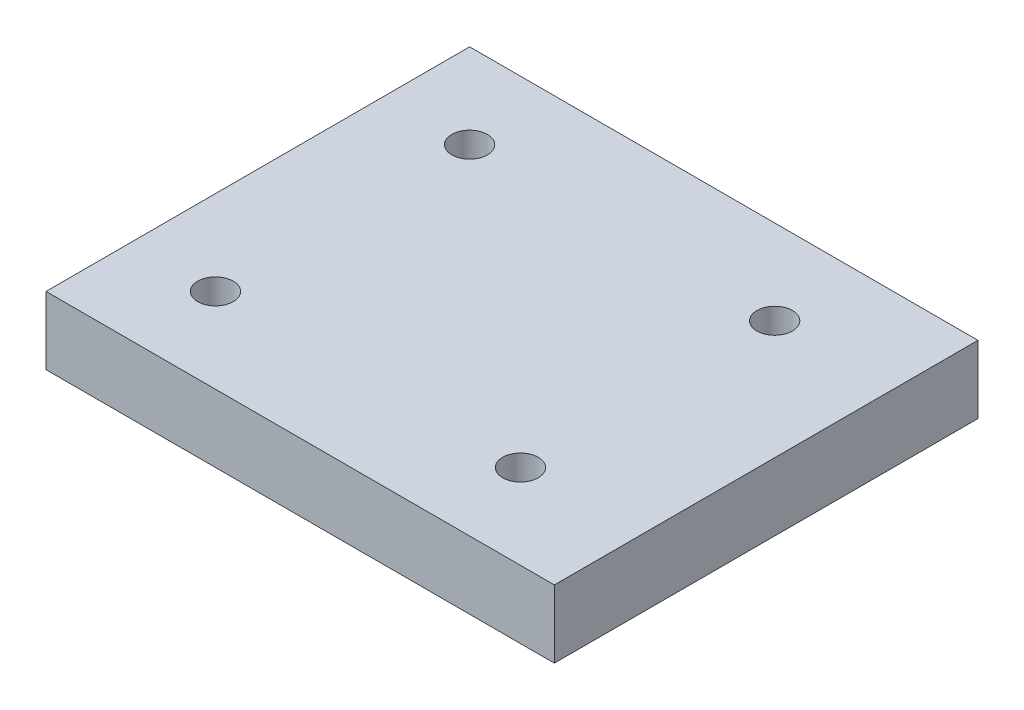
ISO-10303-21;
HEADER;
FILE_DESCRIPTION(('STEP AP214'),'2;1');
FILE_NAME('part.step','',(''),(''),'','','');
FILE_SCHEMA(('AUTOMOTIVE_DESIGN { 1 0 10303 214 1 1 1 1 }'));
ENDSEC;
DATA;
#1=APPLICATION_CONTEXT('core data for automotive mechanical design processes');
#2=APPLICATION_PROTOCOL_DEFINITION('international standard','automotive_design',2000,#1);
#3=PRODUCT_CONTEXT('',#1,'mechanical');
#4=PRODUCT('Part','Part','',(#3));
#5=PRODUCT_RELATED_PRODUCT_CATEGORY('part','',(#4));
#6=PRODUCT_DEFINITION_FORMATION('','',#4);
#7=PRODUCT_DEFINITION_CONTEXT('part definition',#1,'design');
#8=PRODUCT_DEFINITION('design','',#6,#7);
#9=PRODUCT_DEFINITION_SHAPE('','',#8);
#10=(LENGTH_UNIT() NAMED_UNIT(*) SI_UNIT(.MILLI.,.METRE.));
#11=(NAMED_UNIT(*) PLANE_ANGLE_UNIT() SI_UNIT($,.RADIAN.));
#12=(NAMED_UNIT(*) SI_UNIT($,.STERADIAN.) SOLID_ANGLE_UNIT());
#13=UNCERTAINTY_MEASURE_WITH_UNIT(LENGTH_MEASURE(1.E-05),#10,'distance_accuracy_value','');
#14=(GEOMETRIC_REPRESENTATION_CONTEXT(3) GLOBAL_UNCERTAINTY_ASSIGNED_CONTEXT((#13)) GLOBAL_UNIT_ASSIGNED_CONTEXT((#10,
#11,#12)) REPRESENTATION_CONTEXT('',''));
#15=CARTESIAN_POINT('',(0.,0.,0.));
#16=DIRECTION('',(0.,0.,1.));
#17=DIRECTION('',(1.,0.,0.));
#18=AXIS2_PLACEMENT_3D('',#15,#16,#17);
#19=CARTESIAN_POINT('',(30.,8.,-25.));
#20=DIRECTION('',(-1.,0.,0.));
#21=DIRECTION('',(0.,0.,1.));
#22=AXIS2_PLACEMENT_3D('',#19,#20,#21);
#23=PLANE('',#22);
#24=DIRECTION('',(0.,0.,-1.));
#25=VECTOR('',#24,1.);
#26=CARTESIAN_POINT('',(30.,0.,-25.));
#27=LINE('',#26,#25);
#28=CARTESIAN_POINT('',(30.,0.,25.));
#29=VERTEX_POINT('',#28);
#30=CARTESIAN_POINT('',(30.,0.,-25.));
#31=VERTEX_POINT('',#30);
#32=EDGE_CURVE('E104',#29,#31,#27,.T.);
#33=ORIENTED_EDGE('',*,*,#32,.T.);
#34=DIRECTION('',(0.,-1.,0.));
#35=VECTOR('',#34,1.);
#36=CARTESIAN_POINT('',(30.,8.,-25.));
#37=LINE('',#36,#35);
#38=CARTESIAN_POINT('',(30.,8.,-25.));
#39=VERTEX_POINT('',#38);
#40=EDGE_CURVE('E11',#39,#31,#37,.T.);
#41=ORIENTED_EDGE('',*,*,#40,.F.);
#42=DIRECTION('',(0.,0.,-1.));
#43=VECTOR('',#42,1.);
#44=CARTESIAN_POINT('',(30.,8.,-25.));
#45=LINE('',#44,#43);
#46=CARTESIAN_POINT('',(30.,8.,25.));
#47=VERTEX_POINT('',#46);
#48=EDGE_CURVE('E92',#47,#39,#45,.T.);
#49=ORIENTED_EDGE('',*,*,#48,.F.);
#50=DIRECTION('',(0.,-1.,0.));
#51=VECTOR('',#50,1.);
#52=CARTESIAN_POINT('',(30.,8.,25.));
#53=LINE('',#52,#51);
#54=EDGE_CURVE('E100',#47,#29,#53,.T.);
#55=ORIENTED_EDGE('',*,*,#54,.T.);
#56=EDGE_LOOP('',(#33,#41,#49,#55));
#57=FACE_BOUND('',#56,.T.);
#58=ADVANCED_FACE('F41',(#57),#23,.F.);
#59=CARTESIAN_POINT('',(-30.,8.,-25.));
#60=DIRECTION('',(0.,0.,1.));
#61=DIRECTION('',(1.,0.,0.));
#62=AXIS2_PLACEMENT_3D('',#59,#60,#61);
#63=PLANE('',#62);
#64=DIRECTION('',(-1.,0.,0.));
#65=VECTOR('',#64,1.);
#66=CARTESIAN_POINT('',(-30.,0.,-25.));
#67=LINE('',#66,#65);
#68=CARTESIAN_POINT('',(-30.,0.,-25.));
#69=VERTEX_POINT('',#68);
#70=EDGE_CURVE('E96',#31,#69,#67,.T.);
#71=ORIENTED_EDGE('',*,*,#70,.T.);
#72=DIRECTION('',(0.,-1.,0.));
#73=VECTOR('',#72,1.);
#74=CARTESIAN_POINT('',(-30.,8.,-25.));
#75=LINE('',#74,#73);
#76=CARTESIAN_POINT('',(-30.,8.,-25.));
#77=VERTEX_POINT('',#76);
#78=EDGE_CURVE('E49',#77,#69,#75,.T.);
#79=ORIENTED_EDGE('',*,*,#78,.F.);
#80=DIRECTION('',(-1.,0.,0.));
#81=VECTOR('',#80,1.);
#82=CARTESIAN_POINT('',(-30.,8.,-25.));
#83=LINE('',#82,#81);
#84=EDGE_CURVE('E87',#39,#77,#83,.T.);
#85=ORIENTED_EDGE('',*,*,#84,.F.);
#86=ORIENTED_EDGE('',*,*,#40,.T.);
#87=EDGE_LOOP('',(#71,#79,#85,#86));
#88=FACE_BOUND('',#87,.T.);
#89=ADVANCED_FACE('F95',(#88),#63,.F.);
#90=CARTESIAN_POINT('',(-30.,8.,-25.));
#91=DIRECTION('',(1.,0.,0.));
#92=DIRECTION('',(0.,0.,-1.));
#93=AXIS2_PLACEMENT_3D('',#90,#91,#92);
#94=PLANE('',#93);
#95=DIRECTION('',(0.,0.,1.));
#96=VECTOR('',#95,1.);
#97=CARTESIAN_POINT('',(-30.,0.,-25.));
#98=LINE('',#97,#96);
#99=CARTESIAN_POINT('',(-30.,0.,25.));
#100=VERTEX_POINT('',#99);
#101=EDGE_CURVE('E74',#69,#100,#98,.T.);
#102=ORIENTED_EDGE('',*,*,#101,.T.);
#103=DIRECTION('',(0.,-1.,0.));
#104=VECTOR('',#103,1.);
#105=CARTESIAN_POINT('',(-30.,8.,25.));
#106=LINE('',#105,#104);
#107=CARTESIAN_POINT('',(-30.,8.,25.));
#108=VERTEX_POINT('',#107);
#109=EDGE_CURVE('E97',#108,#100,#106,.T.);
#110=ORIENTED_EDGE('',*,*,#109,.F.);
#111=DIRECTION('',(0.,0.,1.));
#112=VECTOR('',#111,1.);
#113=CARTESIAN_POINT('',(-30.,8.,-25.));
#114=LINE('',#113,#112);
#115=EDGE_CURVE('E90',#77,#108,#114,.T.);
#116=ORIENTED_EDGE('',*,*,#115,.F.);
#117=ORIENTED_EDGE('',*,*,#78,.T.);
#118=EDGE_LOOP('',(#102,#110,#116,#117));
#119=FACE_BOUND('',#118,.T.);
#120=ADVANCED_FACE('F98',(#119),#94,.F.);
#121=CARTESIAN_POINT('',(-30.,8.,25.));
#122=DIRECTION('',(0.,0.,-1.));
#123=DIRECTION('',(-1.,0.,0.));
#124=AXIS2_PLACEMENT_3D('',#121,#122,#123);
#125=PLANE('',#124);
#126=DIRECTION('',(1.,0.,0.));
#127=VECTOR('',#126,1.);
#128=CARTESIAN_POINT('',(-30.,0.,25.));
#129=LINE('',#128,#127);
#130=EDGE_CURVE('E80',#100,#29,#129,.T.);
#131=ORIENTED_EDGE('',*,*,#130,.T.);
#132=ORIENTED_EDGE('',*,*,#54,.F.);
#133=DIRECTION('',(1.,0.,0.));
#134=VECTOR('',#133,1.);
#135=CARTESIAN_POINT('',(-30.,8.,25.));
#136=LINE('',#135,#134);
#137=EDGE_CURVE('E57',#108,#47,#136,.T.);
#138=ORIENTED_EDGE('',*,*,#137,.F.);
#139=ORIENTED_EDGE('',*,*,#109,.T.);
#140=EDGE_LOOP('',(#131,#132,#138,#139));
#141=FACE_BOUND('',#140,.T.);
#142=ADVANCED_FACE('F112',(#141),#125,.F.);
#143=CARTESIAN_POINT('',(0.,8.,0.));
#144=DIRECTION('',(0.,1.,0.));
#145=DIRECTION('',(0.,0.,1.));
#146=AXIS2_PLACEMENT_3D('',#143,#144,#145);
#147=PLANE('',#146);
#148=CARTESIAN_POINT('',(-20.,8.,15.));
#149=DIRECTION('',(0.,1.,0.));
#150=DIRECTION('',(0.,0.,1.));
#151=AXIS2_PLACEMENT_3D('',#148,#149,#150);
#152=CIRCLE('',#151,2.1);
#153=CARTESIAN_POINT('',(-20.,8.,17.1));
#154=VERTEX_POINT('',#153);
#155=EDGE_CURVE('E138',#154,#154,#152,.T.);
#156=ORIENTED_EDGE('',*,*,#155,.F.);
#157=EDGE_LOOP('',(#156));
#158=FACE_BOUND('',#157,.T.);
#159=CARTESIAN_POINT('',(16.,8.,15.));
#160=DIRECTION('',(0.,1.,0.));
#161=DIRECTION('',(0.,0.,1.));
#162=AXIS2_PLACEMENT_3D('',#159,#160,#161);
#163=CIRCLE('',#162,2.1);
#164=CARTESIAN_POINT('',(16.,8.,17.1));
#165=VERTEX_POINT('',#164);
#166=EDGE_CURVE('E132',#165,#165,#163,.T.);
#167=ORIENTED_EDGE('',*,*,#166,.F.);
#168=EDGE_LOOP('',(#167));
#169=FACE_BOUND('',#168,.T.);
#170=CARTESIAN_POINT('',(16.,8.,-15.));
#171=DIRECTION('',(0.,1.,0.));
#172=DIRECTION('',(0.,0.,1.));
#173=AXIS2_PLACEMENT_3D('',#170,#171,#172);
#174=CIRCLE('',#173,2.1);
#175=CARTESIAN_POINT('',(16.,8.,-12.9));
#176=VERTEX_POINT('',#175);
#177=EDGE_CURVE('E126',#176,#176,#174,.T.);
#178=ORIENTED_EDGE('',*,*,#177,.F.);
#179=EDGE_LOOP('',(#178));
#180=FACE_BOUND('',#179,.T.);
#181=CARTESIAN_POINT('',(-20.,8.,-15.));
#182=DIRECTION('',(0.,1.,0.));
#183=DIRECTION('',(0.,0.,1.));
#184=AXIS2_PLACEMENT_3D('',#181,#182,#183);
#185=CIRCLE('',#184,2.1);
#186=CARTESIAN_POINT('',(-20.,8.,-12.9));
#187=VERTEX_POINT('',#186);
#188=EDGE_CURVE('E120',#187,#187,#185,.T.);
#189=ORIENTED_EDGE('',*,*,#188,.F.);
#190=EDGE_LOOP('',(#189));
#191=FACE_BOUND('',#190,.T.);
#192=ORIENTED_EDGE('',*,*,#48,.T.);
#193=ORIENTED_EDGE('',*,*,#84,.T.);
#194=ORIENTED_EDGE('',*,*,#115,.T.);
#195=ORIENTED_EDGE('',*,*,#137,.T.);
#196=EDGE_LOOP('',(#192,#193,#194,#195));
#197=FACE_BOUND('',#196,.T.);
#198=ADVANCED_FACE('F88',(#158,#169,#180,#191,#197),#147,.T.);
#199=CARTESIAN_POINT('',(0.,0.,0.));
#200=DIRECTION('',(0.,1.,0.));
#201=DIRECTION('',(0.,0.,1.));
#202=AXIS2_PLACEMENT_3D('',#199,#200,#201);
#203=PLANE('',#202);
#204=CARTESIAN_POINT('',(-20.,0.,15.));
#205=DIRECTION('',(0.,1.,0.));
#206=DIRECTION('',(0.,0.,1.));
#207=AXIS2_PLACEMENT_3D('',#204,#205,#206);
#208=CIRCLE('',#207,2.1);
#209=CARTESIAN_POINT('',(-20.,0.,17.1));
#210=VERTEX_POINT('',#209);
#211=EDGE_CURVE('E135',#210,#210,#208,.T.);
#212=ORIENTED_EDGE('',*,*,#211,.T.);
#213=EDGE_LOOP('',(#212));
#214=FACE_BOUND('',#213,.T.);
#215=CARTESIAN_POINT('',(16.,0.,15.));
#216=DIRECTION('',(0.,1.,0.));
#217=DIRECTION('',(0.,0.,1.));
#218=AXIS2_PLACEMENT_3D('',#215,#216,#217);
#219=CIRCLE('',#218,2.1);
#220=CARTESIAN_POINT('',(16.,0.,17.1));
#221=VERTEX_POINT('',#220);
#222=EDGE_CURVE('E129',#221,#221,#219,.T.);
#223=ORIENTED_EDGE('',*,*,#222,.T.);
#224=EDGE_LOOP('',(#223));
#225=FACE_BOUND('',#224,.T.);
#226=CARTESIAN_POINT('',(16.,0.,-15.));
#227=DIRECTION('',(0.,1.,0.));
#228=DIRECTION('',(0.,0.,1.));
#229=AXIS2_PLACEMENT_3D('',#226,#227,#228);
#230=CIRCLE('',#229,2.1);
#231=CARTESIAN_POINT('',(16.,0.,-12.9));
#232=VERTEX_POINT('',#231);
#233=EDGE_CURVE('E123',#232,#232,#230,.T.);
#234=ORIENTED_EDGE('',*,*,#233,.T.);
#235=EDGE_LOOP('',(#234));
#236=FACE_BOUND('',#235,.T.);
#237=CARTESIAN_POINT('',(-20.,0.,-15.));
#238=DIRECTION('',(0.,1.,0.));
#239=DIRECTION('',(0.,0.,1.));
#240=AXIS2_PLACEMENT_3D('',#237,#238,#239);
#241=CIRCLE('',#240,2.1);
#242=CARTESIAN_POINT('',(-20.,0.,-12.9));
#243=VERTEX_POINT('',#242);
#244=EDGE_CURVE('E107',#243,#243,#241,.T.);
#245=ORIENTED_EDGE('',*,*,#244,.T.);
#246=EDGE_LOOP('',(#245));
#247=FACE_BOUND('',#246,.T.);
#248=ORIENTED_EDGE('',*,*,#32,.F.);
#249=ORIENTED_EDGE('',*,*,#130,.F.);
#250=ORIENTED_EDGE('',*,*,#101,.F.);
#251=ORIENTED_EDGE('',*,*,#70,.F.);
#252=EDGE_LOOP('',(#248,#249,#250,#251));
#253=FACE_BOUND('',#252,.T.);
#254=ADVANCED_FACE('F115',(#214,#225,#236,#247,#253),#203,.F.);
#255=CARTESIAN_POINT('',(-20.,8.,-15.));
#256=DIRECTION('',(0.,1.,0.));
#257=DIRECTION('',(0.,0.,1.));
#258=AXIS2_PLACEMENT_3D('',#255,#256,#257);
#259=CYLINDRICAL_SURFACE('',#258,2.1);
#260=ORIENTED_EDGE('',*,*,#244,.F.);
#261=EDGE_LOOP('',(#260));
#262=FACE_BOUND('',#261,.T.);
#263=ORIENTED_EDGE('',*,*,#188,.T.);
#264=EDGE_LOOP('',(#263));
#265=FACE_BOUND('',#264,.T.);
#266=ADVANCED_FACE('F153',(#262,#265),#259,.F.);
#267=CARTESIAN_POINT('',(16.,8.,-15.));
#268=DIRECTION('',(0.,1.,0.));
#269=DIRECTION('',(0.,0.,1.));
#270=AXIS2_PLACEMENT_3D('',#267,#268,#269);
#271=CYLINDRICAL_SURFACE('',#270,2.1);
#272=ORIENTED_EDGE('',*,*,#233,.F.);
#273=EDGE_LOOP('',(#272));
#274=FACE_BOUND('',#273,.T.);
#275=ORIENTED_EDGE('',*,*,#177,.T.);
#276=EDGE_LOOP('',(#275));
#277=FACE_BOUND('',#276,.T.);
#278=ADVANCED_FACE('F155',(#274,#277),#271,.F.);
#279=CARTESIAN_POINT('',(16.,8.,15.));
#280=DIRECTION('',(0.,1.,0.));
#281=DIRECTION('',(0.,0.,1.));
#282=AXIS2_PLACEMENT_3D('',#279,#280,#281);
#283=CYLINDRICAL_SURFACE('',#282,2.1);
#284=ORIENTED_EDGE('',*,*,#222,.F.);
#285=EDGE_LOOP('',(#284));
#286=FACE_BOUND('',#285,.T.);
#287=ORIENTED_EDGE('',*,*,#166,.T.);
#288=EDGE_LOOP('',(#287));
#289=FACE_BOUND('',#288,.T.);
#290=ADVANCED_FACE('F162',(#286,#289),#283,.F.);
#291=CARTESIAN_POINT('',(-20.,8.,15.));
#292=DIRECTION('',(0.,1.,0.));
#293=DIRECTION('',(0.,0.,1.));
#294=AXIS2_PLACEMENT_3D('',#291,#292,#293);
#295=CYLINDRICAL_SURFACE('',#294,2.1);
#296=ORIENTED_EDGE('',*,*,#211,.F.);
#297=EDGE_LOOP('',(#296));
#298=FACE_BOUND('',#297,.T.);
#299=ORIENTED_EDGE('',*,*,#155,.T.);
#300=EDGE_LOOP('',(#299));
#301=FACE_BOUND('',#300,.T.);
#302=ADVANCED_FACE('F142',(#298,#301),#295,.F.);
#303=CLOSED_SHELL('',(#58,#89,#120,#142,#198,#254,#266,#278,#290,#302));
#304=MANIFOLD_SOLID_BREP('B2',#303);
#305=ADVANCED_BREP_SHAPE_REPRESENTATION('',(#18,#304),#14);
#306=SHAPE_DEFINITION_REPRESENTATION(#9,#305);
ENDSEC;
END-ISO-10303-21;
